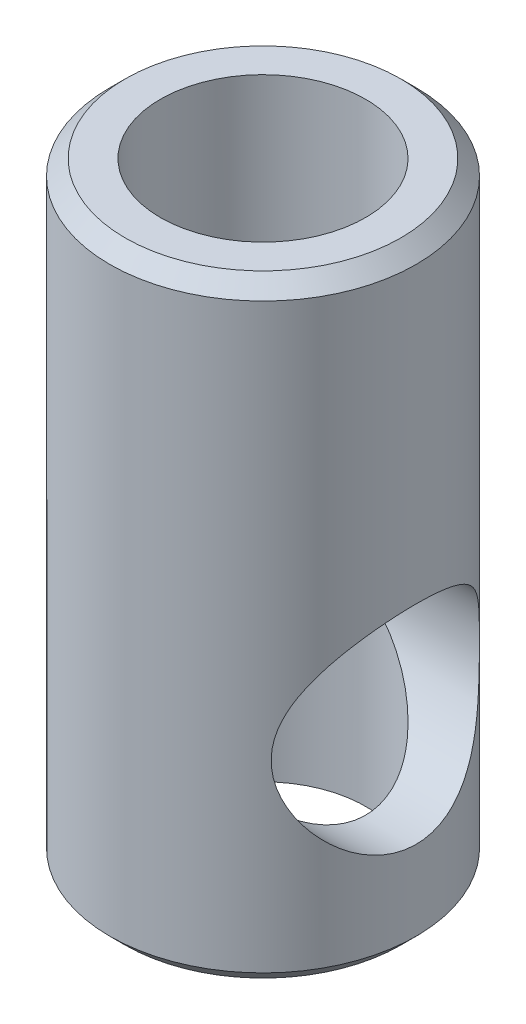
ISO-10303-21;
HEADER;
FILE_DESCRIPTION(('STEP AP214'),'2;1');
FILE_NAME('part.step','',(''),(''),'','','');
FILE_SCHEMA(('AUTOMOTIVE_DESIGN { 1 0 10303 214 1 1 1 1 }'));
ENDSEC;
DATA;
#1=APPLICATION_CONTEXT('core data for automotive mechanical design processes');
#2=APPLICATION_PROTOCOL_DEFINITION('international standard','automotive_design',2000,#1);
#3=PRODUCT_CONTEXT('',#1,'mechanical');
#4=PRODUCT('Part','Part','',(#3));
#5=PRODUCT_RELATED_PRODUCT_CATEGORY('part','',(#4));
#6=PRODUCT_DEFINITION_FORMATION('','',#4);
#7=PRODUCT_DEFINITION_CONTEXT('part definition',#1,'design');
#8=PRODUCT_DEFINITION('design','',#6,#7);
#9=PRODUCT_DEFINITION_SHAPE('','',#8);
#10=(LENGTH_UNIT() NAMED_UNIT(*) SI_UNIT(.MILLI.,.METRE.));
#11=(NAMED_UNIT(*) PLANE_ANGLE_UNIT() SI_UNIT($,.RADIAN.));
#12=(NAMED_UNIT(*) SI_UNIT($,.STERADIAN.) SOLID_ANGLE_UNIT());
#13=UNCERTAINTY_MEASURE_WITH_UNIT(LENGTH_MEASURE(1.E-05),#10,'distance_accuracy_value','');
#14=(GEOMETRIC_REPRESENTATION_CONTEXT(3) GLOBAL_UNCERTAINTY_ASSIGNED_CONTEXT((#13)) GLOBAL_UNIT_ASSIGNED_CONTEXT((#10,
#11,#12)) REPRESENTATION_CONTEXT('',''));
#15=CARTESIAN_POINT('',(0.,0.,0.));
#16=DIRECTION('',(0.,0.,1.));
#17=DIRECTION('',(1.,0.,0.));
#18=AXIS2_PLACEMENT_3D('',#15,#16,#17);
#19=CARTESIAN_POINT('',(0.,0.,0.));
#20=DIRECTION('',(0.,1.,0.));
#21=DIRECTION('',(0.,0.,1.));
#22=AXIS2_PLACEMENT_3D('',#19,#20,#21);
#23=CYLINDRICAL_SURFACE('',#22,3.35);
#24=CARTESIAN_POINT('',(0.,5.91905249806889,3.35));
#25=CARTESIAN_POINT('',(0.0439623851782986,5.91903452786912,3.34999806472464));
#26=CARTESIAN_POINT('',(0.0880173710148057,5.91388607891871,3.34911579506336));
#27=CARTESIAN_POINT('',(0.174263639585694,5.89498391835163,3.34574858884309));
#28=CARTESIAN_POINT('',(0.216439931013727,5.88117095714873,3.34325261382313));
#29=CARTESIAN_POINT('',(0.301539047282528,5.84670763373969,3.33669562524604));
#30=CARTESIAN_POINT('',(0.344261247190914,5.82560618994305,3.33252727152574));
#31=CARTESIAN_POINT('',(0.427464880746107,5.77956003534029,3.32287946100156));
#32=CARTESIAN_POINT('',(0.467941076553898,5.75460681508355,3.31739708603157));
#33=CARTESIAN_POINT('',(0.587362523159864,5.67610001288488,3.29909864505432));
#34=CARTESIAN_POINT('',(0.663771734531115,5.61916524537362,3.28447677434776));
#35=CARTESIAN_POINT('',(0.797584786647272,5.51390378647904,3.25423094354207));
#36=CARTESIAN_POINT('',(0.855687631786739,5.46618833612479,3.23941890827266));
#37=CARTESIAN_POINT('',(0.970155089900703,5.36962552345799,3.20699857506386));
#38=CARTESIAN_POINT('',(1.02651971069314,5.3207781662381,3.18939028970325));
#39=CARTESIAN_POINT('',(1.19375660397676,5.17344918925596,3.13230851027964));
#40=CARTESIAN_POINT('',(1.30262534311286,5.07430166389654,3.08861173248982));
#41=CARTESIAN_POINT('',(1.51557838042795,4.87737556282652,2.98985256026257));
#42=CARTESIAN_POINT('',(1.61967791892955,4.77959343928558,2.93482998355986));
#43=CARTESIAN_POINT('',(1.82321081960593,4.58674685339341,2.81291019347728));
#44=CARTESIAN_POINT('',(1.92264805491897,4.49168016185164,2.74602306557727));
#45=CARTESIAN_POINT('',(2.08920583636258,4.3316094688714,2.62018384640405));
#46=CARTESIAN_POINT('',(2.1576153312944,4.26560527852777,2.56420807734024));
#47=CARTESIAN_POINT('',(2.29118333387431,4.13637236791503,2.44560134420055));
#48=CARTESIAN_POINT('',(2.35634159667265,4.07314385672484,2.38296987999369));
#49=CARTESIAN_POINT('',(2.54600855833429,3.88872025811157,2.18487992757305));
#50=CARTESIAN_POINT('',(2.66499025353782,3.77251608446584,2.03901861162007));
#51=CARTESIAN_POINT('',(2.85577333712912,3.58578231631028,1.75746473292479));
#52=CARTESIAN_POINT('',(2.93205904060399,3.51096953564912,1.62764534087877));
#53=CARTESIAN_POINT('',(3.06868919516377,3.3768312380715,1.35245882556544));
#54=CARTESIAN_POINT('',(3.12905381793467,3.3174861250696,1.20711170704843));
#55=CARTESIAN_POINT('',(3.22197237757514,3.22608054381034,0.92715430934452));
#56=CARTESIAN_POINT('',(3.25740103644612,3.19120272782421,0.794426773176839));
#57=CARTESIAN_POINT('',(3.31190134865702,3.137535485255,0.522488645980093));
#58=CARTESIAN_POINT('',(3.330982633916,3.11873658493981,0.38328192355885));
#59=CARTESIAN_POINT('',(3.35142950187021,3.09859196847822,0.101865668515589));
#60=CARTESIAN_POINT('',(3.35274140949605,3.09729913202583,-0.0403516629260111));
#61=CARTESIAN_POINT('',(3.33740675407323,3.11240761583699,-0.322852896600733));
#62=CARTESIAN_POINT('',(3.32075836799423,3.12881073229942,-0.463136601100275));
#63=CARTESIAN_POINT('',(3.27188758245116,3.17693945390984,-0.731457912402938));
#64=CARTESIAN_POINT('',(3.24039661119362,3.20794539620651,-0.859762583679806));
#65=CARTESIAN_POINT('',(3.164045472807,3.28307016649274,-1.10826222069976));
#66=CARTESIAN_POINT('',(3.11917792760078,3.32719623107291,-1.22845266591645));
#67=CARTESIAN_POINT('',(2.99834260833408,3.4459230822971,-1.50437970559369));
#68=CARTESIAN_POINT('',(2.91707862256629,3.52568881490888,-1.65557351482796));
#69=CARTESIAN_POINT('',(2.73802135761134,3.70108368417063,-1.93745368028768));
#70=CARTESIAN_POINT('',(2.6402093062438,3.79673083444,-2.06811641763997));
#71=CARTESIAN_POINT('',(2.46506479170282,3.96745321073576,-2.27108696418114));
#72=CARTESIAN_POINT('',(2.39096735140461,4.03953662837233,-2.34882279483207));
#73=CARTESIAN_POINT('',(2.23794638865838,4.18795434519141,-2.49505556821144));
#74=CARTESIAN_POINT('',(2.15902007995531,4.26429109623333,-2.56354710251005));
#75=CARTESIAN_POINT('',(1.99668840550109,4.42062918446191,-2.69193455070737));
#76=CARTESIAN_POINT('',(1.91325872510115,4.50064998012911,-2.75177567241104));
#77=CARTESIAN_POINT('',(1.74299496152062,4.66292055581712,-2.86265297028896));
#78=CARTESIAN_POINT('',(1.65616408645913,4.74516821380033,-2.91369720969064));
#79=CARTESIAN_POINT('',(1.47594619195549,4.91415618281167,-3.00913148778578));
#80=CARTESIAN_POINT('',(1.38243542461165,5.00094838062657,-3.05319454977325));
#81=CARTESIAN_POINT('',(1.19155322820837,5.1749735096999,-3.13264271847222));
#82=CARTESIAN_POINT('',(1.09417014990368,5.2622069531233,-3.16799890870076));
#83=CARTESIAN_POINT('',(0.945168243703067,5.39083561194569,-3.21431332980005));
#84=CARTESIAN_POINT('',(0.895308668091493,5.4331042272381,-3.22856826639537));
#85=CARTESIAN_POINT('',(0.794101806863971,5.51650367207555,-3.2549409886966));
#86=CARTESIAN_POINT('',(0.742754943806716,5.55763481842358,-3.26705937462431));
#87=CARTESIAN_POINT('',(0.638285971655377,5.63757321977029,-3.28906189016123));
#88=CARTESIAN_POINT('',(0.585175559765211,5.67639231378974,-3.29895828134242));
#89=CARTESIAN_POINT('',(0.475965252147176,5.75007028832156,-3.31647671191804));
#90=CARTESIAN_POINT('',(0.419872617562182,5.78493819392581,-3.32410400186039));
#91=CARTESIAN_POINT('',(0.322380260255068,5.83641855179646,-3.33468299508524));
#92=CARTESIAN_POINT('',(0.282265747782886,5.85525275101071,-3.33834661398078));
#93=CARTESIAN_POINT('',(0.199734879901415,5.88684248548995,-3.34429325222318));
#94=CARTESIAN_POINT('',(0.157334283689794,5.89963487120818,-3.34658466458276));
#95=CARTESIAN_POINT('',(0.0806724054546333,5.91438565129484,-3.34919418702016));
#96=CARTESIAN_POINT('',(0.0467885275286041,5.91816194753381,-3.34984546116824));
#97=CARTESIAN_POINT('',(-0.0211353117418617,5.91965988711129,-3.35010542762384));
#98=CARTESIAN_POINT('',(-0.0551753148263753,5.91737980418965,-3.34971382267766));
#99=CARTESIAN_POINT('',(-0.130897852417956,5.90595134389963,-3.34770738678523));
#100=CARTESIAN_POINT('',(-0.172320095574676,5.89520235122925,-3.34580655250238));
#101=CARTESIAN_POINT('',(-0.253010202893116,5.86749991422461,-3.34067939152511));
#102=CARTESIAN_POINT('',(-0.292266587965697,5.85051649756308,-3.33744665228323));
#103=CARTESIAN_POINT('',(-0.388156384453282,5.8031268429009,-3.32794244971632));
#104=CARTESIAN_POINT('',(-0.443476233832153,5.77028639849789,-3.32096168267218));
#105=CARTESIAN_POINT('',(-0.551045665304778,5.70031047171435,-3.30481571862579));
#106=CARTESIAN_POINT('',(-0.603286406883393,5.66316345203653,-3.29564458063833));
#107=CARTESIAN_POINT('',(-0.705979583006067,5.58635734314274,-3.27518661697102));
#108=CARTESIAN_POINT('',(-0.756418423683168,5.54668369083001,-3.26388661928474));
#109=CARTESIAN_POINT('',(-0.855694951513702,5.46612998021729,-3.23927342020906));
#110=CARTESIAN_POINT('',(-0.904534477722233,5.42525141821029,-3.22596263757195));
#111=CARTESIAN_POINT('',(-1.06791482024008,5.28580840615279,-3.17750148114372));
#112=CARTESIAN_POINT('',(-1.17980197667018,5.18573513906741,-3.13762873503081));
#113=CARTESIAN_POINT('',(-1.39904256986185,4.98576005074626,-3.04618567858187));
#114=CARTESIAN_POINT('',(-1.50639095419764,4.88585853347008,-2.9946027193812));
#115=CARTESIAN_POINT('',(-1.71609561980965,4.68858753013784,-2.87954236688942));
#116=CARTESIAN_POINT('',(-1.8184699371737,4.59120960455918,-2.81611273823471));
#117=CARTESIAN_POINT('',(-2.01797338836229,4.40026231703398,-2.67676470918748));
#118=CARTESIAN_POINT('',(-2.11510652189323,4.30669006468679,-2.60085601623204));
#119=CARTESIAN_POINT('',(-2.33309797923104,4.09586910916841,-2.40964024468361));
#120=CARTESIAN_POINT('',(-2.45166655048015,3.98056487596905,-2.28948344571812));
#121=CARTESIAN_POINT('',(-2.67400839728279,3.76371979314201,-2.0253116272282));
#122=CARTESIAN_POINT('',(-2.77779882598259,3.66216299358656,-1.88132469454973));
#123=CARTESIAN_POINT('',(-2.94570161844085,3.49759373690723,-1.60191476841699));
#124=CARTESIAN_POINT('',(-3.01357875885858,3.43095555407178,-1.47090817040276));
#125=CARTESIAN_POINT('',(-3.13322283547264,3.31339341345042,-1.19495572039632));
#126=CARTESIAN_POINT('',(-3.18499904546874,3.26246040995218,-1.05001795568166));
#127=CARTESIAN_POINT('',(-3.24806985867941,3.2003872413246,-0.823884746039208));
#128=CARTESIAN_POINT('',(-3.26672002826642,3.18202589277153,-0.746623289426567));
#129=CARTESIAN_POINT('',(-3.29861127713061,3.15062267282826,-0.589948768036869));
#130=CARTESIAN_POINT('',(-3.31185524150884,3.13757796414064,-0.510536875064773));
#131=CARTESIAN_POINT('',(-3.33261472469935,3.11712877819129,-0.350287665123893));
#132=CARTESIAN_POINT('',(-3.34013330278818,3.10972128876512,-0.26945113305021));
#133=CARTESIAN_POINT('',(-3.34927395268731,3.10071543886095,-0.107152858797925));
#134=CARTESIAN_POINT('',(-3.35089692594995,3.0991161902888,-0.025691214109545));
#135=CARTESIAN_POINT('',(-3.34721878551388,3.10274043762259,0.194430097353977));
#136=CARTESIAN_POINT('',(-3.33623828822351,3.11356020702051,0.332980637022291));
#137=CARTESIAN_POINT('',(-3.29772995259784,3.15149104628482,0.605350535926403));
#138=CARTESIAN_POINT('',(-3.27020065333337,3.17860355447504,0.739169476351879));
#139=CARTESIAN_POINT('',(-3.20056515187801,3.24714286768619,0.998412223409368));
#140=CARTESIAN_POINT('',(-3.15851936174432,3.28851034764766,1.12386829127814));
#141=CARTESIAN_POINT('',(-3.06205922320947,3.38333052590809,1.36498728792976));
#142=CARTESIAN_POINT('',(-3.00764051293156,3.43678748612608,1.48064674328871));
#143=CARTESIAN_POINT('',(-2.85952453430319,3.58210958017662,1.75510873195268));
#144=CARTESIAN_POINT('',(-2.75962477057654,3.67998152628056,1.90739150787707));
#145=CARTESIAN_POINT('',(-2.54324155310957,3.89135462453797,2.18767985890993));
#146=CARTESIAN_POINT('',(-2.42671116416266,4.00489997963955,2.31561424820497));
#147=CARTESIAN_POINT('',(-2.2196485526643,4.20567740497623,2.51181604866486));
#148=CARTESIAN_POINT('',(-2.13222730209063,4.29018173178893,2.5862976674081));
#149=CARTESIAN_POINT('',(-1.95259939650331,4.46295952915306,2.72446412832554));
#150=CARTESIAN_POINT('',(-1.86039039402531,4.55123484481089,2.78814360759209));
#151=CARTESIAN_POINT('',(-1.67204530674769,4.73014955537972,2.90500122083339));
#152=CARTESIAN_POINT('',(-1.57591473693322,4.82078556962279,2.95819352776397));
#153=CARTESIAN_POINT('',(-1.37991116092394,5.00322532836432,3.05455070837047));
#154=CARTESIAN_POINT('',(-1.28004006073002,5.09502846281409,3.09772061039583));
#155=CARTESIAN_POINT('',(-1.10093099564092,5.25565243117005,3.16500128193762));
#156=CARTESIAN_POINT('',(-1.02259598369912,5.32462194297162,3.1911929195875));
#157=CARTESIAN_POINT('',(-0.862632042106696,5.46086127790323,3.23810839182258));
#158=CARTESIAN_POINT('',(-0.780999652731928,5.52812918867215,3.25882630183349));
#159=CARTESIAN_POINT('',(-0.633715714436901,5.6412350991913,3.29014659626955));
#160=CARTESIAN_POINT('',(-0.569196542964993,5.68821374197813,3.30198272119085));
#161=CARTESIAN_POINT('',(-0.435342431661902,5.77585038915792,3.32228337882432));
#162=CARTESIAN_POINT('',(-0.366022197247966,5.81652655780698,3.33075771496087));
#163=CARTESIAN_POINT('',(-0.256709452358659,5.86565861007018,3.34034498952072));
#164=CARTESIAN_POINT('',(-0.219605653709217,5.88000775585175,3.34301365165824));
#165=CARTESIAN_POINT('',(-0.143577657416097,5.90265828910654,3.34713567556114));
#166=CARTESIAN_POINT('',(-0.104663303318263,5.91098905456811,3.34859494603859));
#167=CARTESIAN_POINT('',(-0.0544908506470534,5.9166036977241,3.34957455617922));
#168=CARTESIAN_POINT('',(-0.0436133411334669,5.91751853102715,3.34973373226646));
#169=CARTESIAN_POINT('',(-0.0218257875344827,5.91874511962626,3.3499466870024));
#170=CARTESIAN_POINT('',(-0.0109157482577712,5.91905696002372,3.35000048052394));
#171=CARTESIAN_POINT('',(0.,5.91905249806889,3.35));
#172=B_SPLINE_CURVE_WITH_KNOTS('',3,(#24,#25,#26,#27,#28,#29,#30,#31,#32,#33,#34,#35,#36,#37,
#38,#39,#40,#41,#42,#43,#44,#45,#46,#47,#48,#49,#50,#51,#52,#53,#54,#55,#56,#57,#58,#59,#60,#61,
#62,#63,#64,#65,#66,#67,#68,#69,#70,#71,#72,#73,#74,#75,#76,#77,#78,#79,#80,#81,#82,#83,#84,#85,
#86,#87,#88,#89,#90,#91,#92,#93,#94,#95,#96,#97,#98,#99,#100,#101,#102,#103,#104,#105,#106,#107,
#108,#109,#110,#111,#112,#113,#114,#115,#116,#117,#118,#119,#120,#121,#122,#123,#124,#125,#126,
#127,#128,#129,#130,#131,#132,#133,#134,#135,#136,#137,#138,#139,#140,#141,#142,#143,#144,#145,
#146,#147,#148,#149,#150,#151,#152,#153,#154,#155,#156,#157,#158,#159,#160,#161,#162,#163,#164,
#165,#166,#167,#168,#169,#170,#171),.UNSPECIFIED.,.T.,.F.,(4,2,2,2,2,2,2,2,2,2,2,2,2,2,2,2,2,2,
2,2,2,2,2,2,2,2,2,2,2,2,2,2,2,2,2,2,2,2,2,2,2,2,2,2,2,2,2,2,2,2,2,2,2,2,2,2,2,2,2,2,2,2,2,2,2,2,
2,2,2,2,2,2,2,4),(0.,0.131826302395599,0.264564035062631,0.407706461008521,0.551169770794921,
0.839861747735211,1.06970222074298,1.29954165985558,1.75979772173289,2.21846249756536,
2.67673923699271,3.00741226297294,3.33811015441373,3.99819252847475,4.50082860728986,
5.00282476350884,5.42621260384274,5.84935081095352,6.27376688640108,6.69822604556473,
7.10366201195667,7.50932201848677,8.07405555823687,8.63943408273626,9.02698399670085,
9.41475967516357,9.80489298605488,10.1946667763143,10.5992671092988,11.0051935721647,
11.2058567527278,11.4064634707866,11.6059343816476,11.8049400745699,11.9380482968737,
12.0703338276346,12.1721187122123,12.2739326118232,12.4016637841091,12.5300172497038,
12.7236337165189,12.9177814192249,13.1131723721112,13.3083301357145,13.7736824938054,
14.239539917381,14.7035580827442,15.167216982712,15.7784639595101,16.3889955685625,
16.8729149384475,17.3565550624,17.6009568049344,17.8452279478225,18.0893684762287,
18.3334716733821,18.7494355777565,19.1654362088419,19.5797260668294,19.9941622032157,
20.6110211696081,21.2296567972541,21.6568927113913,22.0843401172652,22.5112058260014,
22.9378569065126,23.2605341175577,23.5835591656233,23.825496576807,24.0667231865704,
24.186007025711,24.3047045869672,24.3374413425923,24.3701734776862),.UNSPECIFIED.);
#173=CARTESIAN_POINT('',(0.,5.91905249806889,3.35));
#174=VERTEX_POINT('',#173);
#175=EDGE_CURVE('E54',#174,#174,#172,.T.);
#176=ORIENTED_EDGE('',*,*,#175,.T.);
#177=EDGE_LOOP('',(#176));
#178=FACE_BOUND('',#177,.T.);
#179=CARTESIAN_POINT('',(0.,0.,0.));
#180=DIRECTION('',(0.,1.,0.));
#181=DIRECTION('',(0.,0.,1.));
#182=AXIS2_PLACEMENT_3D('',#179,#180,#181);
#183=CIRCLE('',#182,3.35);
#184=CARTESIAN_POINT('',(0.,0.,3.35));
#185=VERTEX_POINT('',#184);
#186=EDGE_CURVE('E53',#185,#185,#183,.T.);
#187=ORIENTED_EDGE('',*,*,#186,.F.);
#188=EDGE_LOOP('',(#187));
#189=FACE_BOUND('',#188,.T.);
#190=ADVANCED_FACE('F33',(#178,#189),#23,.F.);
#191=CARTESIAN_POINT('',(0.,0.,0.));
#192=DIRECTION('',(0.,1.,0.));
#193=DIRECTION('',(0.,0.,1.));
#194=AXIS2_PLACEMENT_3D('',#191,#192,#193);
#195=PLANE('',#194);
#196=CARTESIAN_POINT('',(0.,0.,0.));
#197=DIRECTION('',(0.,1.,0.));
#198=DIRECTION('',(0.,0.,1.));
#199=AXIS2_PLACEMENT_3D('',#196,#197,#198);
#200=CIRCLE('',#199,4.5);
#201=CARTESIAN_POINT('',(0.,0.,4.5));
#202=VERTEX_POINT('',#201);
#203=EDGE_CURVE('E10',#202,#202,#200,.F.);
#204=ORIENTED_EDGE('',*,*,#203,.T.);
#205=EDGE_LOOP('',(#204));
#206=FACE_BOUND('',#205,.T.);
#207=ORIENTED_EDGE('',*,*,#186,.T.);
#208=EDGE_LOOP('',(#207));
#209=FACE_BOUND('',#208,.T.);
#210=ADVANCED_FACE('F92',(#206,#209),#195,.F.);
#211=CARTESIAN_POINT('',(0.,20.,0.));
#212=DIRECTION('',(0.,1.,0.));
#213=DIRECTION('',(0.,0.,1.));
#214=AXIS2_PLACEMENT_3D('',#211,#212,#213);
#215=CYLINDRICAL_SURFACE('',#214,5.);
#216=CARTESIAN_POINT('',(0.,19.5,0.));
#217=DIRECTION('',(0.,-1.,0.));
#218=DIRECTION('',(0.,0.,-1.));
#219=AXIS2_PLACEMENT_3D('',#216,#217,#218);
#220=CIRCLE('',#219,5.);
#221=CARTESIAN_POINT('',(0.,19.5,-5.));
#222=VERTEX_POINT('',#221);
#223=EDGE_CURVE('E40',#222,#222,#220,.T.);
#224=ORIENTED_EDGE('',*,*,#223,.T.);
#225=EDGE_LOOP('',(#224));
#226=FACE_BOUND('',#225,.T.);
#227=CARTESIAN_POINT('',(0.,0.5,0.));
#228=DIRECTION('',(0.,1.,0.));
#229=DIRECTION('',(0.,0.,1.));
#230=AXIS2_PLACEMENT_3D('',#227,#228,#229);
#231=CIRCLE('',#230,5.);
#232=CARTESIAN_POINT('',(0.,0.5,5.));
#233=VERTEX_POINT('',#232);
#234=EDGE_CURVE('E44',#233,#233,#231,.T.);
#235=ORIENTED_EDGE('',*,*,#234,.T.);
#236=EDGE_LOOP('',(#235));
#237=FACE_BOUND('',#236,.T.);
#238=CARTESIAN_POINT('',(-5.,9.9,0.));
#239=CARTESIAN_POINT('',(-4.99999379754221,9.89999313671967,0.170071412933929));
#240=CARTESIAN_POINT('',(-4.99124394726156,9.8871628699533,0.34018762878352));
#241=CARTESIAN_POINT('',(-4.95709368262945,9.83663230683821,0.674986491817607));
#242=CARTESIAN_POINT('',(-4.93168185778301,9.79891496714994,0.839665334131769));
#243=CARTESIAN_POINT('',(-4.86670931431736,9.7009673114579,1.15821624002657));
#244=CARTESIAN_POINT('',(-4.82721757811424,9.64084669318219,1.31213669085729));
#245=CARTESIAN_POINT('',(-4.73721970198923,9.50068898486497,1.60703091690267));
#246=CARTESIAN_POINT('',(-4.68671231865286,9.4206496463118,1.74800322801371));
#247=CARTESIAN_POINT('',(-4.57349505925956,9.23545145579277,2.02674385114573));
#248=CARTESIAN_POINT('',(-4.5101081616381,9.1287205418135,2.16318487204606));
#249=CARTESIAN_POINT('',(-4.3790539229543,8.89693390755037,2.41751348877072));
#250=CARTESIAN_POINT('',(-4.31138040705437,8.77185139438897,2.53537342566426));
#251=CARTESIAN_POINT('',(-4.20505879450574,8.56082471782457,2.70610068741068));
#252=CARTESIAN_POINT('',(-4.16607553068975,8.48031212519362,2.76557447057535));
#253=CARTESIAN_POINT('',(-4.08958263717546,8.31387972394594,2.8774839395455));
#254=CARTESIAN_POINT('',(-4.05207336288054,8.22795862408482,2.92991793521697));
#255=CARTESIAN_POINT('',(-3.94374157557023,7.96257974543242,3.07595665679275));
#256=CARTESIAN_POINT('',(-3.87688828101203,7.77508098058068,3.1586446840846));
#257=CARTESIAN_POINT('',(-3.7825677599955,7.44087646811611,3.27045609202449));
#258=CARTESIAN_POINT('',(-3.74930032111789,7.29866440705767,3.30819867148645));
#259=CARTESIAN_POINT('',(-3.69833051578608,7.00793633094295,3.3650909830708));
#260=CARTESIAN_POINT('',(-3.680600108965,6.85943218160186,3.38427421660365));
#261=CARTESIAN_POINT('',(-3.6634727474694,6.55938303708684,3.40281604059143));
#262=CARTESIAN_POINT('',(-3.6641623574749,6.40782702987935,3.40208102520501));
#263=CARTESIAN_POINT('',(-3.68397189098517,6.10732555201095,3.3806118785229));
#264=CARTESIAN_POINT('',(-3.70310516936646,5.95838205261584,3.35986325556638));
#265=CARTESIAN_POINT('',(-3.75529267520972,5.67496347099455,3.3013912241245));
#266=CARTESIAN_POINT('',(-3.78756416185567,5.54013926069762,3.26461516414671));
#267=CARTESIAN_POINT('',(-3.86216699461495,5.27848805015691,3.17600695109887));
#268=CARTESIAN_POINT('',(-3.90450613103583,5.15166733963312,3.1241631317168));
#269=CARTESIAN_POINT('',(-4.01787197396246,4.84712954385919,2.97806617290995));
#270=CARTESIAN_POINT('',(-4.09280361684193,4.67484450171609,2.87547124091789));
#271=CARTESIAN_POINT('',(-4.24675188540495,4.35172046015526,2.64284501014807));
#272=CARTESIAN_POINT('',(-4.32577589345511,4.20092219910321,2.51276272518319));
#273=CARTESIAN_POINT('',(-4.48026750776573,3.92194744002686,2.22576045104788));
#274=CARTESIAN_POINT('',(-4.55569836425437,3.79397828313889,2.06861767878051));
#275=CARTESIAN_POINT('',(-4.69451577956614,3.56629993496087,1.73053207774279));
#276=CARTESIAN_POINT('',(-4.75792711475772,3.46653239704599,1.5496395383851));
#277=CARTESIAN_POINT('',(-4.85376052313937,3.31858598447527,1.21031812251475));
#278=CARTESIAN_POINT('',(-4.88993590136625,3.26387431000232,1.0557942509248));
#279=CARTESIAN_POINT('',(-4.94787512765953,3.17696981268351,0.737937683786678));
#280=CARTESIAN_POINT('',(-4.96964868952906,3.1447618106298,0.574611006170908));
#281=CARTESIAN_POINT('',(-4.99686599120607,3.10457785864007,0.243059679549883));
#282=CARTESIAN_POINT('',(-5.00225464370477,3.09668365238314,0.0748204234146109));
#283=CARTESIAN_POINT('',(-4.99601834150487,3.10585633032721,-0.260662596303329));
#284=CARTESIAN_POINT('',(-4.98439253876036,3.12292445871765,-0.427906309848314));
#285=CARTESIAN_POINT('',(-4.9462992143931,3.17941616110803,-0.747437638567901));
#286=CARTESIAN_POINT('',(-4.92065320949067,3.21760357151959,-0.900047748369173));
#287=CARTESIAN_POINT('',(-4.85715830656358,3.31357906807078,-1.19623514421437));
#288=CARTESIAN_POINT('',(-4.81930717047773,3.37137074915677,-1.33981076782461));
#289=CARTESIAN_POINT('',(-4.73058382723068,3.50977019698339,-1.62662113661425));
#290=CARTESIAN_POINT('',(-4.67890793612585,3.59184166117864,-1.76889541573913));
#291=CARTESIAN_POINT('',(-4.56800730235859,3.77384902651318,-2.03827658329355));
#292=CARTESIAN_POINT('',(-4.50877680902653,3.8737985602605,-2.1653717729659));
#293=CARTESIAN_POINT('',(-4.37635912927187,4.10764820140525,-2.42318500327142));
#294=CARTESIAN_POINT('',(-4.30249593251157,4.24443081682193,-2.55094438647673));
#295=CARTESIAN_POINT('',(-4.15628739672658,4.53762946922112,-2.78281456782194));
#296=CARTESIAN_POINT('',(-4.08394273111718,4.69405401062656,-2.88691506711087));
#297=CARTESIAN_POINT('',(-3.958163841109,5.00201970131565,-3.05654923609815));
#298=CARTESIAN_POINT('',(-3.90349935582682,5.1512010669556,-3.12543640805701));
#299=CARTESIAN_POINT('',(-3.80743484176221,5.46164439981458,-3.24178383741316));
#300=CARTESIAN_POINT('',(-3.76600879778757,5.62288189573049,-3.28928619471078));
#301=CARTESIAN_POINT('',(-3.708063965905,5.92712079879966,-3.35437905995446));
#302=CARTESIAN_POINT('',(-3.68857015551482,6.06876268415598,-3.37560309382006));
#303=CARTESIAN_POINT('',(-3.66617104186076,6.35485358515967,-3.39992506795482));
#304=CARTESIAN_POINT('',(-3.66325103659319,6.49929999882686,-3.40303907301474));
#305=CARTESIAN_POINT('',(-3.67444337801691,6.78663582679467,-3.3909465536332));
#306=CARTESIAN_POINT('',(-3.68854603086687,6.9295260805381,-3.37575045619881));
#307=CARTESIAN_POINT('',(-3.73161842547704,7.21014089122974,-3.32806631877975));
#308=CARTESIAN_POINT('',(-3.76060902503849,7.34785790928861,-3.29555401666084));
#309=CARTESIAN_POINT('',(-3.84093673857146,7.65844119838114,-3.20188962723743));
#310=CARTESIAN_POINT('',(-3.89645644489005,7.82844818101033,-3.13490135545771));
#311=CARTESIAN_POINT('',(-4.01849162330636,8.15255891149135,-2.97685755826161));
#312=CARTESIAN_POINT('',(-4.08502361197318,8.30663819785503,-2.88576575685677));
#313=CARTESIAN_POINT('',(-4.22317893126136,8.60056475788136,-2.67964327311611));
#314=CARTESIAN_POINT('',(-4.29487790619102,8.74006212586728,-2.56416664172378));
#315=CARTESIAN_POINT('',(-4.435859272984,8.99974500985711,-2.31171566737488));
#316=CARTESIAN_POINT('',(-4.50514096829084,9.11992499481933,-2.17473518945098));
#317=CARTESIAN_POINT('',(-4.60705079049048,9.2905777646502,-1.9450745729422));
#318=CARTESIAN_POINT('',(-4.64248216683703,9.34858602720363,-1.85914274463261));
#319=CARTESIAN_POINT('',(-4.70979259877776,9.45701844485621,-1.6813313368936));
#320=CARTESIAN_POINT('',(-4.74167342912665,9.50744639345469,-1.58945476560855));
#321=CARTESIAN_POINT('',(-4.80091081831998,9.60000103770361,-1.40037564974994));
#322=CARTESIAN_POINT('',(-4.82827367150954,9.64213929831448,-1.30318077038827));
#323=CARTESIAN_POINT('',(-4.87764292518459,9.71748466731234,-1.10413786445615));
#324=CARTESIAN_POINT('',(-4.89965179949851,9.75069590121686,-1.00229201282288));
#325=CARTESIAN_POINT('',(-4.94502974124755,9.81876638344047,-0.75382225010434));
#326=CARTESIAN_POINT('',(-4.96551129815005,9.84910884971332,-0.605381156229831));
#327=CARTESIAN_POINT('',(-4.9929959285727,9.88972385251264,-0.304637414212092));
#328=CARTESIAN_POINT('',(-5.00000555567695,9.90000614759014,-0.152336680190557));
#329=CARTESIAN_POINT('',(-5.,9.9,0.));
#330=B_SPLINE_CURVE_WITH_KNOTS('',3,(#238,#239,#240,#241,#242,#243,#244,#245,#246,#247,#248,
#249,#250,#251,#252,#253,#254,#255,#256,#257,#258,#259,#260,#261,#262,#263,#264,#265,#266,#267,
#268,#269,#270,#271,#272,#273,#274,#275,#276,#277,#278,#279,#280,#281,#282,#283,#284,#285,#286,
#287,#288,#289,#290,#291,#292,#293,#294,#295,#296,#297,#298,#299,#300,#301,#302,#303,#304,#305,
#306,#307,#308,#309,#310,#311,#312,#313,#314,#315,#316,#317,#318,#319,#320,#321,#322,#323,#324,
#325,#326,#327,#328,#329),.UNSPECIFIED.,.T.,.F.,(4,2,2,2,2,2,2,2,2,2,2,2,2,2,2,2,2,2,2,2,2,2,2,
2,2,2,2,2,2,2,2,2,2,2,2,2,2,2,2,2,2,2,2,2,2,4),(0.,0.509612086753705,1.01957353234679,
1.52707007756964,2.03462393721375,2.58599569043238,3.13818059436469,3.46008923425403,
3.78207502129199,4.42428680379039,4.87512521908833,5.32514830069297,5.77728663163133,
6.22975259754471,6.65848810582837,7.08755645377093,7.72640915389398,8.36645742827396,
9.0120517536887,9.65630045949822,10.1577842965794,10.6589295446876,11.1617578284616,
11.6646111753945,12.140742953508,12.6169620898477,13.1315700100089,13.6465720213541,
14.2478325138809,14.8493542394407,15.3670109381426,15.8836440304181,16.3153469363973,
16.746666834927,17.1777412268631,17.6094212021585,18.1792780810038,18.7499975253678,
19.3322329043585,19.9146346958288,20.2429248238322,20.5710501111201,20.8987143322708,
21.2262268659946,21.6829197659253,22.139390445752),.UNSPECIFIED.);
#331=CARTESIAN_POINT('',(-5.,9.9,0.));
#332=VERTEX_POINT('',#331);
#333=EDGE_CURVE('E83',#332,#332,#330,.T.);
#334=ORIENTED_EDGE('',*,*,#333,.T.);
#335=EDGE_LOOP('',(#334));
#336=FACE_BOUND('',#335,.T.);
#337=CARTESIAN_POINT('',(3.66606055596467,6.5,-3.4));
#338=CARTESIAN_POINT('',(3.66605513004881,6.41754237350806,-3.40000307203115));
#339=CARTESIAN_POINT('',(3.66885265267402,6.33510901160302,-3.39699608529816));
#340=CARTESIAN_POINT('',(3.67988298003789,6.17101308749241,-3.3850452457807));
#341=CARTESIAN_POINT('',(3.68811725619618,6.089350740027,-3.37609978578609));
#342=CARTESIAN_POINT('',(3.70963480428641,5.92742213413877,-3.35244124789039));
#343=CARTESIAN_POINT('',(3.72292582084349,5.84715821565788,-3.33771932198423));
#344=CARTESIAN_POINT('',(3.75395348004184,5.68869558773078,-3.30278336410215));
#345=CARTESIAN_POINT('',(3.77169247370172,5.61049799469776,-3.28256642721231));
#346=CARTESIAN_POINT('',(3.83010903948732,5.38135511882258,-3.21462353553021));
#347=CARTESIAN_POINT('',(3.87626364652114,5.23398794910649,-3.15932053161995));
#348=CARTESIAN_POINT('',(3.97767328024433,4.9509942403575,-3.03064511817614));
#349=CARTESIAN_POINT('',(4.03292963174995,4.81536941488767,-2.95727007737263));
#350=CARTESIAN_POINT('',(4.15711422031109,4.53535982694508,-2.78062551346201));
#351=CARTESIAN_POINT('',(4.22680219335304,4.39315611800297,-2.67443176550145));
#352=CARTESIAN_POINT('',(4.3657832728554,4.12660672588774,-2.44098366318953));
#353=CARTESIAN_POINT('',(4.43507584402914,4.00228140724902,-2.31370564207452));
#354=CARTESIAN_POINT('',(4.53960943252356,3.82214485602595,-2.09754466039498));
#355=CARTESIAN_POINT('',(4.57686372508493,3.75958575568536,-2.01517198286057));
#356=CARTESIAN_POINT('',(4.64838906786289,3.64172787258745,-1.84419466409957));
#357=CARTESIAN_POINT('',(4.68266144579532,3.58642585293775,-1.75559282854709));
#358=CARTESIAN_POINT('',(4.74722234648027,3.48375894414529,-1.57266372565406));
#359=CARTESIAN_POINT('',(4.77751564154631,3.43638452798765,-1.47834351889436));
#360=CARTESIAN_POINT('',(4.83323038268321,3.35020745831159,-1.28454642612132));
#361=CARTESIAN_POINT('',(4.85865378875018,3.31140135531905,-1.18507163525312));
#362=CARTESIAN_POINT('',(4.91475002558846,3.22643246723435,-0.932257413732929));
#363=CARTESIAN_POINT('',(4.94198362128448,3.1858376349482,-0.776203540881886));
#364=CARTESIAN_POINT('',(4.98153785775134,3.12713921997712,-0.458187593325381));
#365=CARTESIAN_POINT('',(4.99386998652732,3.10901831115968,-0.296230169215659));
#366=CARTESIAN_POINT('',(5.00256787490633,3.09622121282021,0.0293404882725851));
#367=CARTESIAN_POINT('',(4.99890641714151,3.10158498881115,0.192956071154487));
#368=CARTESIAN_POINT('',(4.97588591834255,3.13553972531433,0.516633867143182));
#369=CARTESIAN_POINT('',(4.95652228151618,3.16413748606994,0.676695025830246));
#370=CARTESIAN_POINT('',(4.90428497086455,3.24226560607359,0.985979880823404));
#371=CARTESIAN_POINT('',(4.87166878052432,3.29139750165294,1.13534960661627));
#372=CARTESIAN_POINT('',(4.7954104624915,3.40841035133082,1.42347413117832));
#373=CARTESIAN_POINT('',(4.75176623867021,3.47629487002108,1.56222690541489));
#374=CARTESIAN_POINT('',(4.6509219193234,3.63722974179678,1.84213890357839));
#375=CARTESIAN_POINT('',(4.59274837893339,3.73225415914635,1.98180671510916));
#376=CARTESIAN_POINT('',(4.47042878083369,3.94034682907863,2.24416298037636));
#377=CARTESIAN_POINT('',(4.40627588244023,4.05343585668411,2.36683157726567));
#378=CARTESIAN_POINT('',(4.26542212176033,4.31637310014332,2.61334257725603));
#379=CARTESIAN_POINT('',(4.18843836494775,4.46920277456861,2.73385588001991));
#380=CARTESIAN_POINT('',(4.04044084751781,4.79523125592687,2.94818133630301));
#381=CARTESIAN_POINT('',(3.96942392625335,4.96841916091876,3.04200768959708));
#382=CARTESIAN_POINT('',(3.85833478527651,5.29014084162937,3.18107352493592));
#383=CARTESIAN_POINT('',(3.81491705415367,5.43480188920218,3.23255709653234));
#384=CARTESIAN_POINT('',(3.74264652747532,5.73304973735152,3.31597194489765));
#385=CARTESIAN_POINT('',(3.71376703455781,5.88661959531206,3.34793908390634));
#386=CARTESIAN_POINT('',(3.67496293465713,6.20051112878107,3.39050810444132));
#387=CARTESIAN_POINT('',(3.66519764161701,6.3608782647058,3.40093045337444));
#388=CARTESIAN_POINT('',(3.66704508137185,6.68135145090114,3.3989384167712));
#389=CARTESIAN_POINT('',(3.67865771425632,6.84145750238844,3.38652413796262));
#390=CARTESIAN_POINT('',(3.71853689211327,7.13770910666454,3.3426320479813));
#391=CARTESIAN_POINT('',(3.74475135335023,7.27450371258157,3.31349178732144));
#392=CARTESIAN_POINT('',(3.80879332196524,7.5409954513235,3.23967254989999));
#393=CARTESIAN_POINT('',(3.84663160625801,7.67068586553144,3.194979148066));
#394=CARTESIAN_POINT('',(3.9492276916616,7.97853260599019,3.06804332859348));
#395=CARTESIAN_POINT('',(4.01841060924106,8.15198666643347,2.9779645731681));
#396=CARTESIAN_POINT('',(4.16363959531992,8.47925908793429,2.771300996843));
#397=CARTESIAN_POINT('',(4.23969827098388,8.63304007761618,2.65466686516819));
#398=CARTESIAN_POINT('',(4.39169871548544,8.92119043566737,2.39498570724208));
#399=CARTESIAN_POINT('',(4.46762344525952,9.05525270684126,2.25158670497547));
#400=CARTESIAN_POINT('',(4.61090712556316,9.29822442298195,1.94129809436407));
#401=CARTESIAN_POINT('',(4.67827946830323,9.40717341677098,1.77444609668592));
#402=CARTESIAN_POINT('',(4.78728970775895,9.57924251619455,1.45108789403179));
#403=CARTESIAN_POINT('',(4.83136897359054,9.64705014950804,1.29790644664172));
#404=CARTESIAN_POINT('',(4.90568560705129,9.75999533895318,0.980199823463243));
#405=CARTESIAN_POINT('',(4.93593183409975,9.80514740672782,0.815681986024171));
#406=CARTESIAN_POINT('',(4.9799426036104,9.87052229207212,0.478703795403035));
#407=CARTESIAN_POINT('',(4.9936266596164,9.89062338442626,0.306208851888005));
#408=CARTESIAN_POINT('',(5.0028375078167,9.9041757920018,-0.0403063081023459));
#409=CARTESIAN_POINT('',(4.99836832506262,9.89763301487066,-0.214326177923532));
#410=CARTESIAN_POINT('',(4.97285643114964,9.8599795150161,-0.543871730849378));
#411=CARTESIAN_POINT('',(4.95319529401442,9.83091623656145,-0.699748152111907));
#412=CARTESIAN_POINT('',(4.90062468157117,9.75222648637836,-1.00384566564613));
#413=CARTESIAN_POINT('',(4.86771245625017,9.70259574619921,-1.15206516165896));
#414=CARTESIAN_POINT('',(4.78914910016548,9.58190744363719,-1.44506429609915));
#415=CARTESIAN_POINT('',(4.74294267094436,9.50990151257499,-1.58930016695532));
#416=CARTESIAN_POINT('',(4.64188665678079,9.34800097037134,-1.86395605199957));
#417=CARTESIAN_POINT('',(4.58703491382356,9.25810189132461,-1.99437260302546));
#418=CARTESIAN_POINT('',(4.46308907440461,9.04707567788602,-2.25953270855035));
#419=CARTESIAN_POINT('',(4.39311276621821,8.92325990439086,-2.39171907948566));
#420=CARTESIAN_POINT('',(4.2517231020534,8.65638936028221,-2.63489138933666));
#421=CARTESIAN_POINT('',(4.18030686855796,8.51329195513518,-2.74582898887739));
#422=CARTESIAN_POINT('',(4.07265768648962,8.27549638810997,-2.90140743488579));
#423=CARTESIAN_POINT('',(4.03459136618568,8.18670234855331,-2.95394264686112));
#424=CARTESIAN_POINT('',(3.96155042795542,8.00363988849391,-3.05119818501606));
#425=CARTESIAN_POINT('',(3.92657671291641,7.90936988250308,-3.09591623266958));
#426=CARTESIAN_POINT('',(3.8614213026379,7.71606594055496,-3.17680940363541));
#427=CARTESIAN_POINT('',(3.83122250364557,7.61705074361659,-3.21301525561881));
#428=CARTESIAN_POINT('',(3.77715952746551,7.41456859685897,-3.27640096421229));
#429=CARTESIAN_POINT('',(3.75328965013071,7.31110575110816,-3.30358894834838));
#430=CARTESIAN_POINT('',(3.71171372495508,7.09116257128643,-3.35026210715336));
#431=CARTESIAN_POINT('',(3.69474771906087,6.97434445281149,-3.36884349965761));
#432=CARTESIAN_POINT('',(3.67192787890562,6.73833317835508,-3.39370710054448));
#433=CARTESIAN_POINT('',(3.66606839575445,6.61914126090149,-3.39999556128789));
#434=CARTESIAN_POINT('',(3.66606055596467,6.5,-3.4));
#435=B_SPLINE_CURVE_WITH_KNOTS('',3,(#337,#338,#339,#340,#341,#342,#343,#344,#345,#346,#347,
#348,#349,#350,#351,#352,#353,#354,#355,#356,#357,#358,#359,#360,#361,#362,#363,#364,#365,#366,
#367,#368,#369,#370,#371,#372,#373,#374,#375,#376,#377,#378,#379,#380,#381,#382,#383,#384,#385,
#386,#387,#388,#389,#390,#391,#392,#393,#394,#395,#396,#397,#398,#399,#400,#401,#402,#403,#404,
#405,#406,#407,#408,#409,#410,#411,#412,#413,#414,#415,#416,#417,#418,#419,#420,#421,#422,#423,
#424,#425,#426,#427,#428,#429,#430,#431,#432,#433,#434),.UNSPECIFIED.,.T.,.F.,(4,2,2,2,2,2,2,2,
2,2,2,2,2,2,2,2,2,2,2,2,2,2,2,2,2,2,2,2,2,2,2,2,2,2,2,2,2,2,2,2,2,2,2,2,2,2,2,2,4),(0.,
0.247230605927984,0.494528150546028,0.742205977124565,0.990014993042408,1.47996664753607,
1.96998968070104,2.53996254172067,3.11057957821377,3.4400096746729,3.76929233158751,
4.09817638538853,4.42692779301516,4.91520803760653,5.40311161108625,5.89184580625154,
6.3807230982348,6.86052452786733,7.3404172233704,7.8743984808752,8.40899831893801,
9.03426257066663,9.65919350245749,10.1361468268292,10.6122210712425,11.0922467044859,
11.5722700943183,11.9975056650935,12.4231366848979,13.0418475721785,13.6617168538947,
14.2903998462843,14.9180859086489,15.4355953526837,15.9527728901963,16.4724537694517,
16.9920194280461,17.4692060716851,17.9464917974834,18.4476738332844,18.9489811712089,
19.529292696232,20.1109091023629,20.4404408619918,20.7700685130777,21.0984872957336,
21.4266092752537,21.7840093160652,22.1412275307634),.UNSPECIFIED.);
#436=CARTESIAN_POINT('',(3.66606055596467,6.5,-3.4));
#437=VERTEX_POINT('',#436);
#438=EDGE_CURVE('E61',#437,#437,#435,.T.);
#439=ORIENTED_EDGE('',*,*,#438,.T.);
#440=EDGE_LOOP('',(#439));
#441=FACE_BOUND('',#440,.T.);
#442=ADVANCED_FACE('F87',(#226,#237,#336,#441),#215,.T.);
#443=CARTESIAN_POINT('',(5.,20.,0.));
#444=DIRECTION('',(0.,-1.,0.));
#445=DIRECTION('',(0.,0.,-1.));
#446=AXIS2_PLACEMENT_3D('',#443,#444,#445);
#447=PLANE('',#446);
#448=CARTESIAN_POINT('',(0.,20.,0.));
#449=DIRECTION('',(0.,-1.,0.));
#450=DIRECTION('',(0.,0.,-1.));
#451=AXIS2_PLACEMENT_3D('',#448,#449,#450);
#452=CIRCLE('',#451,4.5);
#453=CARTESIAN_POINT('',(0.,20.,-4.5));
#454=VERTEX_POINT('',#453);
#455=EDGE_CURVE('E48',#454,#454,#452,.F.);
#456=ORIENTED_EDGE('',*,*,#455,.T.);
#457=EDGE_LOOP('',(#456));
#458=FACE_BOUND('',#457,.T.);
#459=CARTESIAN_POINT('',(0.,20.,0.));
#460=DIRECTION('',(0.,1.,0.));
#461=DIRECTION('',(0.,0.,1.));
#462=AXIS2_PLACEMENT_3D('',#459,#460,#461);
#463=CIRCLE('',#462,3.35);
#464=CARTESIAN_POINT('',(0.,20.,3.35));
#465=VERTEX_POINT('',#464);
#466=EDGE_CURVE('E118',#465,#465,#463,.T.);
#467=ORIENTED_EDGE('',*,*,#466,.F.);
#468=EDGE_LOOP('',(#467));
#469=FACE_BOUND('',#468,.T.);
#470=ADVANCED_FACE('F91',(#458,#469),#447,.F.);
#471=CARTESIAN_POINT('',(0.,7.08094750193111,3.35));
#472=CARTESIAN_POINT('',(-0.0439623851782986,7.08096547213088,3.34999806472464));
#473=CARTESIAN_POINT('',(-0.0880173710148056,7.08611392108129,3.34911579506336));
#474=CARTESIAN_POINT('',(-0.174263639585694,7.10501608164837,3.34574858884309));
#475=CARTESIAN_POINT('',(-0.216439931013727,7.11882904285127,3.34325261382313));
#476=CARTESIAN_POINT('',(-0.301539047282528,7.1532923662603,3.33669562524604));
#477=CARTESIAN_POINT('',(-0.344261247190915,7.17439381005695,3.33252727152574));
#478=CARTESIAN_POINT('',(-0.427464880746107,7.22043996465971,3.32287946100156));
#479=CARTESIAN_POINT('',(-0.467941076553897,7.24539318491645,3.31739708603157));
#480=CARTESIAN_POINT('',(-0.587362523159864,7.32389998711512,3.29909864505432));
#481=CARTESIAN_POINT('',(-0.663771734531115,7.38083475462638,3.28447677434776));
#482=CARTESIAN_POINT('',(-0.797584786647272,7.48609621352096,3.25423094354207));
#483=CARTESIAN_POINT('',(-0.855687631786738,7.53381166387521,3.23941890827266));
#484=CARTESIAN_POINT('',(-0.970155089900702,7.63037447654201,3.20699857506386));
#485=CARTESIAN_POINT('',(-1.02651971069314,7.6792218337619,3.18939028970325));
#486=CARTESIAN_POINT('',(-1.19375660397676,7.82655081074404,3.13230851027964));
#487=CARTESIAN_POINT('',(-1.30262534311286,7.92569833610346,3.08861173248982));
#488=CARTESIAN_POINT('',(-1.51557838042795,8.12262443717348,2.98985256026257));
#489=CARTESIAN_POINT('',(-1.61967791892955,8.22040656071442,2.93482998355986));
#490=CARTESIAN_POINT('',(-1.82321081960593,8.41325314660659,2.81291019347728));
#491=CARTESIAN_POINT('',(-1.92264805491897,8.50831983814836,2.74602306557727));
#492=CARTESIAN_POINT('',(-2.08920583636258,8.6683905311286,2.62018384640405));
#493=CARTESIAN_POINT('',(-2.1576153312944,8.73439472147223,2.56420807734024));
#494=CARTESIAN_POINT('',(-2.29118333387432,8.86362763208497,2.44560134420055));
#495=CARTESIAN_POINT('',(-2.35634159667265,8.92685614327516,2.38296987999369));
#496=CARTESIAN_POINT('',(-2.54600855833429,9.11127974188843,2.18487992757305));
#497=CARTESIAN_POINT('',(-2.66499025353782,9.22748391553416,2.03901861162007));
#498=CARTESIAN_POINT('',(-2.85577333712912,9.41421768368972,1.75746473292479));
#499=CARTESIAN_POINT('',(-2.93205904060399,9.48903046435088,1.62764534087877));
#500=CARTESIAN_POINT('',(-3.06868919516377,9.6231687619285,1.35245882556545));
#501=CARTESIAN_POINT('',(-3.12905381793467,9.6825138749304,1.20711170704843));
#502=CARTESIAN_POINT('',(-3.22197237757514,9.77391945618965,0.92715430934452));
#503=CARTESIAN_POINT('',(-3.25740103644612,9.80879727217579,0.794426773176839));
#504=CARTESIAN_POINT('',(-3.31190134865702,9.862464514745,0.522488645980094));
#505=CARTESIAN_POINT('',(-3.330982633916,9.88126341506019,0.383281923558851));
#506=CARTESIAN_POINT('',(-3.35142950187021,9.90140803152178,0.101865668515589));
#507=CARTESIAN_POINT('',(-3.35274140949605,9.90270086797416,-0.040351662926011));
#508=CARTESIAN_POINT('',(-3.33740675407323,9.887592384163,-0.322852896600734));
#509=CARTESIAN_POINT('',(-3.32075836799423,9.87118926770058,-0.463136601100275));
#510=CARTESIAN_POINT('',(-3.27188758245116,9.82306054609016,-0.731457912402938));
#511=CARTESIAN_POINT('',(-3.24039661119362,9.79205460379348,-0.859762583679805));
#512=CARTESIAN_POINT('',(-3.164045472807,9.71692983350726,-1.10826222069976));
#513=CARTESIAN_POINT('',(-3.11917792760078,9.67280376892709,-1.22845266591645));
#514=CARTESIAN_POINT('',(-2.99834260833408,9.5540769177029,-1.50437970559369));
#515=CARTESIAN_POINT('',(-2.91707862256629,9.47431118509112,-1.65557351482796));
#516=CARTESIAN_POINT('',(-2.73802135761134,9.29891631582937,-1.93745368028768));
#517=CARTESIAN_POINT('',(-2.64020930624381,9.20326916556001,-2.06811641763996));
#518=CARTESIAN_POINT('',(-2.46506479170282,9.03254678926424,-2.27108696418114));
#519=CARTESIAN_POINT('',(-2.39096735140461,8.96046337162767,-2.34882279483207));
#520=CARTESIAN_POINT('',(-2.23794638865838,8.81204565480859,-2.49505556821144));
#521=CARTESIAN_POINT('',(-2.15902007995531,8.73570890376667,-2.56354710251005));
#522=CARTESIAN_POINT('',(-1.99668840550109,8.57937081553809,-2.69193455070737));
#523=CARTESIAN_POINT('',(-1.91325872510116,8.49935001987089,-2.75177567241104));
#524=CARTESIAN_POINT('',(-1.74299496152062,8.33707944418288,-2.86265297028896));
#525=CARTESIAN_POINT('',(-1.65616408645913,8.25483178619967,-2.91369720969064));
#526=CARTESIAN_POINT('',(-1.47594619195549,8.08584381718833,-3.00913148778578));
#527=CARTESIAN_POINT('',(-1.38243542461165,7.99905161937343,-3.05319454977324));
#528=CARTESIAN_POINT('',(-1.19155322820837,7.8250264903001,-3.13264271847222));
#529=CARTESIAN_POINT('',(-1.09417014990368,7.7377930468767,-3.16799890870076));
#530=CARTESIAN_POINT('',(-0.945168243703068,7.60916438805431,-3.21431332980005));
#531=CARTESIAN_POINT('',(-0.895308668091494,7.5668957727619,-3.22856826639537));
#532=CARTESIAN_POINT('',(-0.794101806863971,7.48349632792445,-3.2549409886966));
#533=CARTESIAN_POINT('',(-0.742754943806715,7.44236518157642,-3.26705937462431));
#534=CARTESIAN_POINT('',(-0.638285971655375,7.36242678022971,-3.28906189016123));
#535=CARTESIAN_POINT('',(-0.585175559765209,7.32360768621026,-3.29895828134242));
#536=CARTESIAN_POINT('',(-0.475965252147176,7.24992971167844,-3.31647671191804));
#537=CARTESIAN_POINT('',(-0.419872617562183,7.21506180607419,-3.32410400186039));
#538=CARTESIAN_POINT('',(-0.322380260255068,7.16358144820353,-3.33468299508524));
#539=CARTESIAN_POINT('',(-0.282265747782885,7.14474724898929,-3.33834661398078));
#540=CARTESIAN_POINT('',(-0.199734879901414,7.11315751451005,-3.34429325222318));
#541=CARTESIAN_POINT('',(-0.157334283689794,7.10036512879182,-3.34658466458276));
#542=CARTESIAN_POINT('',(-0.0806724054546346,7.08561434870515,-3.34919418702016));
#543=CARTESIAN_POINT('',(-0.0467885275286059,7.08183805246618,-3.34984546116824));
#544=CARTESIAN_POINT('',(0.02113531174186,7.08034011288871,-3.35010542762384));
#545=CARTESIAN_POINT('',(0.0551753148263741,7.08262019581035,-3.34971382267766));
#546=CARTESIAN_POINT('',(0.130897852417955,7.09404865610037,-3.34770738678523));
#547=CARTESIAN_POINT('',(0.172320095574675,7.10479764877075,-3.34580655250238));
#548=CARTESIAN_POINT('',(0.253010202893116,7.13250008577539,-3.34067939152511));
#549=CARTESIAN_POINT('',(0.292266587965697,7.14948350243692,-3.33744665228323));
#550=CARTESIAN_POINT('',(0.388156384453281,7.1968731570991,-3.32794244971632));
#551=CARTESIAN_POINT('',(0.443476233832152,7.22971360150211,-3.32096168267218));
#552=CARTESIAN_POINT('',(0.551045665304777,7.29968952828565,-3.30481571862579));
#553=CARTESIAN_POINT('',(0.603286406883392,7.33683654796347,-3.29564458063833));
#554=CARTESIAN_POINT('',(0.705979583006066,7.41364265685726,-3.27518661697102));
#555=CARTESIAN_POINT('',(0.756418423683167,7.45331630916999,-3.26388661928474));
#556=CARTESIAN_POINT('',(0.8556949515137,7.5338700197827,-3.23927342020906));
#557=CARTESIAN_POINT('',(0.904534477722231,7.5747485817897,-3.22596263757195));
#558=CARTESIAN_POINT('',(1.06791482024008,7.71419159384721,-3.17750148114372));
#559=CARTESIAN_POINT('',(1.17980197667018,7.81426486093259,-3.13762873503081));
#560=CARTESIAN_POINT('',(1.39904256986185,8.01423994925374,-3.04618567858187));
#561=CARTESIAN_POINT('',(1.50639095419764,8.11414146652991,-2.9946027193812));
#562=CARTESIAN_POINT('',(1.71609561980965,8.31141246986216,-2.87954236688942));
#563=CARTESIAN_POINT('',(1.8184699371737,8.40879039544081,-2.81611273823472));
#564=CARTESIAN_POINT('',(2.01797338836228,8.59973768296601,-2.67676470918749));
#565=CARTESIAN_POINT('',(2.11510652189322,8.6933099353132,-2.60085601623204));
#566=CARTESIAN_POINT('',(2.33309797923103,8.90413089083158,-2.40964024468361));
#567=CARTESIAN_POINT('',(2.45166655048014,9.01943512403095,-2.28948344571813));
#568=CARTESIAN_POINT('',(2.67400839728278,9.23628020685798,-2.0253116272282));
#569=CARTESIAN_POINT('',(2.77779882598259,9.33783700641343,-1.88132469454973));
#570=CARTESIAN_POINT('',(2.94570161844085,9.50240626309276,-1.601914768417));
#571=CARTESIAN_POINT('',(3.01357875885858,9.56904444592822,-1.47090817040276));
#572=CARTESIAN_POINT('',(3.13322283547264,9.68660658654958,-1.19495572039633));
#573=CARTESIAN_POINT('',(3.18499904546873,9.73753959004782,-1.05001795568167));
#574=CARTESIAN_POINT('',(3.24806985867941,9.7996127586754,-0.823884746039214));
#575=CARTESIAN_POINT('',(3.26672002826642,9.81797410722847,-0.746623289426572));
#576=CARTESIAN_POINT('',(3.2986112771306,9.84937732717174,-0.589948768036874));
#577=CARTESIAN_POINT('',(3.31185524150883,9.86242203585936,-0.510536875064779));
#578=CARTESIAN_POINT('',(3.33261472469935,9.88287122180871,-0.350287665123898));
#579=CARTESIAN_POINT('',(3.34013330278818,9.89027871123488,-0.269451133050214));
#580=CARTESIAN_POINT('',(3.34927395268731,9.89928456113905,-0.10715285879793));
#581=CARTESIAN_POINT('',(3.35089692594995,9.9008838097112,-0.0256912141095497));
#582=CARTESIAN_POINT('',(3.34721878551388,9.89725956237741,0.194430097353971));
#583=CARTESIAN_POINT('',(3.33623828822351,9.88643979297949,0.332980637022286));
#584=CARTESIAN_POINT('',(3.29772995259784,9.84850895371518,0.605350535926398));
#585=CARTESIAN_POINT('',(3.27020065333337,9.82139644552496,0.739169476351874));
#586=CARTESIAN_POINT('',(3.20056515187801,9.75285713231382,0.998412223409365));
#587=CARTESIAN_POINT('',(3.15851936174432,9.71148965235234,1.12386829127814));
#588=CARTESIAN_POINT('',(3.06205922320947,9.61666947409191,1.36498728792976));
#589=CARTESIAN_POINT('',(3.00764051293156,9.56321251387392,1.48064674328871));
#590=CARTESIAN_POINT('',(2.85952453430319,9.41789041982338,1.75510873195268));
#591=CARTESIAN_POINT('',(2.75962477057654,9.32001847371944,1.90739150787707));
#592=CARTESIAN_POINT('',(2.54324155310958,9.10864537546203,2.18767985890993));
#593=CARTESIAN_POINT('',(2.42671116416267,8.99510002036045,2.31561424820496));
#594=CARTESIAN_POINT('',(2.2196485526643,8.79432259502378,2.51181604866485));
#595=CARTESIAN_POINT('',(2.13222730209064,8.70981826821108,2.5862976674081));
#596=CARTESIAN_POINT('',(1.95259939650331,8.53704047084694,2.72446412832554));
#597=CARTESIAN_POINT('',(1.86039039402531,8.44876515518911,2.78814360759208));
#598=CARTESIAN_POINT('',(1.67204530674769,8.26985044462028,2.90500122083338));
#599=CARTESIAN_POINT('',(1.57591473693322,8.17921443037722,2.95819352776396));
#600=CARTESIAN_POINT('',(1.37991116092395,7.99677467163569,3.05455070837047));
#601=CARTESIAN_POINT('',(1.28004006073003,7.90497153718592,3.09772061039582));
#602=CARTESIAN_POINT('',(1.10093099564092,7.74434756882995,3.16500128193762));
#603=CARTESIAN_POINT('',(1.02259598369913,7.67537805702839,3.1911929195875));
#604=CARTESIAN_POINT('',(0.862632042106703,7.53913872209677,3.23810839182258));
#605=CARTESIAN_POINT('',(0.780999652731935,7.47187081132785,3.25882630183349));
#606=CARTESIAN_POINT('',(0.633715714436906,7.35876490080871,3.29014659626955));
#607=CARTESIAN_POINT('',(0.569196542964997,7.31178625802187,3.30198272119085));
#608=CARTESIAN_POINT('',(0.435342431661903,7.22414961084208,3.32228337882432));
#609=CARTESIAN_POINT('',(0.366022197247965,7.18347344219302,3.33075771496087));
#610=CARTESIAN_POINT('',(0.256709452358656,7.13434138992982,3.34034498952072));
#611=CARTESIAN_POINT('',(0.219605653709214,7.11999224414825,3.34301365165824));
#612=CARTESIAN_POINT('',(0.143577657416094,7.09734171089346,3.34713567556114));
#613=CARTESIAN_POINT('',(0.104663303318259,7.08901094543189,3.34859494603859));
#614=CARTESIAN_POINT('',(0.0544908506470497,7.0833963022759,3.34957455617922));
#615=CARTESIAN_POINT('',(0.0436133411334633,7.08248146897285,3.34973373226646));
#616=CARTESIAN_POINT('',(0.0218257875344803,7.08125488037374,3.3499466870024));
#617=CARTESIAN_POINT('',(0.01091574825777,7.08094303997628,3.35000048052394));
#618=CARTESIAN_POINT('',(0.,7.08094750193111,3.35));
#619=B_SPLINE_CURVE_WITH_KNOTS('',3,(#471,#472,#473,#474,#475,#476,#477,#478,#479,#480,#481,
#482,#483,#484,#485,#486,#487,#488,#489,#490,#491,#492,#493,#494,#495,#496,#497,#498,#499,#500,
#501,#502,#503,#504,#505,#506,#507,#508,#509,#510,#511,#512,#513,#514,#515,#516,#517,#518,#519,
#520,#521,#522,#523,#524,#525,#526,#527,#528,#529,#530,#531,#532,#533,#534,#535,#536,#537,#538,
#539,#540,#541,#542,#543,#544,#545,#546,#547,#548,#549,#550,#551,#552,#553,#554,#555,#556,#557,
#558,#559,#560,#561,#562,#563,#564,#565,#566,#567,#568,#569,#570,#571,#572,#573,#574,#575,#576,
#577,#578,#579,#580,#581,#582,#583,#584,#585,#586,#587,#588,#589,#590,#591,#592,#593,#594,#595,
#596,#597,#598,#599,#600,#601,#602,#603,#604,#605,#606,#607,#608,#609,#610,#611,#612,#613,#614,
#615,#616,#617,#618),.UNSPECIFIED.,.T.,.F.,(4,2,2,2,2,2,2,2,2,2,2,2,2,2,2,2,2,2,2,2,2,2,2,2,2,2,
2,2,2,2,2,2,2,2,2,2,2,2,2,2,2,2,2,2,2,2,2,2,2,2,2,2,2,2,2,2,2,2,2,2,2,2,2,2,2,2,2,2,2,2,2,2,2,
4),(0.,0.131826302395599,0.264564035062631,0.407706461008521,0.551169770794921,
0.839861747735211,1.06970222074298,1.29954165985558,1.75979772173289,2.21846249756536,
2.67673923699271,3.00741226297294,3.33811015441373,3.99819252847475,4.50082860728986,
5.00282476350884,5.42621260384274,5.84935081095352,6.27376688640108,6.69822604556473,
7.10366201195666,7.50932201848677,8.07405555823686,8.63943408273626,9.02698399670085,
9.41475967516357,9.80489298605487,10.1946667763143,10.5992671092988,11.0051935721647,
11.2058567527278,11.4064634707866,11.6059343816476,11.8049400745699,11.9380482968737,
12.0703338276346,12.1721187122123,12.2739326118232,12.4016637841091,12.5300172497038,
12.7236337165189,12.9177814192249,13.1131723721112,13.3083301357145,13.7736824938054,
14.2395399173809,14.7035580827442,15.167216982712,15.77846395951,16.3889955685625,
16.8729149384475,17.3565550624,17.6009568049344,17.8452279478225,18.0893684762287,
18.3334716733821,18.7494355777565,19.1654362088419,19.5797260668293,19.9941622032156,
20.6110211696081,21.2296567972541,21.6568927113912,22.0843401172652,22.5112058260014,
22.9378569065125,23.2605341175577,23.5835591656233,23.8254965768069,24.0667231865704,
24.186007025711,24.3047045869672,24.3374413425923,24.3701734776862),.UNSPECIFIED.);
#620=CARTESIAN_POINT('',(0.,7.08094750193111,3.35));
#621=VERTEX_POINT('',#620);
#622=EDGE_CURVE('E62',#621,#621,#619,.T.);
#623=ORIENTED_EDGE('',*,*,#622,.T.);
#624=EDGE_LOOP('',(#623));
#625=FACE_BOUND('',#624,.T.);
#626=ORIENTED_EDGE('',*,*,#466,.T.);
#627=EDGE_LOOP('',(#626));
#628=FACE_BOUND('',#627,.T.);
#629=ADVANCED_FACE('F66',(#625,#628),#23,.F.);
#630=CARTESIAN_POINT('',(-5.,6.5,0.));
#631=DIRECTION('',(1.,0.,0.));
#632=DIRECTION('',(0.,0.,-1.));
#633=AXIS2_PLACEMENT_3D('',#630,#631,#632);
#634=CYLINDRICAL_SURFACE('',#633,3.4);
#635=ORIENTED_EDGE('',*,*,#622,.F.);
#636=EDGE_LOOP('',(#635));
#637=FACE_BOUND('',#636,.T.);
#638=ORIENTED_EDGE('',*,*,#175,.F.);
#639=EDGE_LOOP('',(#638));
#640=FACE_BOUND('',#639,.T.);
#641=ORIENTED_EDGE('',*,*,#438,.F.);
#642=EDGE_LOOP('',(#641));
#643=FACE_BOUND('',#642,.T.);
#644=ORIENTED_EDGE('',*,*,#333,.F.);
#645=EDGE_LOOP('',(#644));
#646=FACE_BOUND('',#645,.T.);
#647=ADVANCED_FACE('F69',(#637,#640,#643,#646),#634,.F.);
#648=CARTESIAN_POINT('',(0.,20.,0.));
#649=DIRECTION('',(0.,-1.,0.));
#650=DIRECTION('',(0.,0.,-1.));
#651=AXIS2_PLACEMENT_3D('',#648,#649,#650);
#652=CONICAL_SURFACE('',#651,4.5,0.785398163397444);
#653=ORIENTED_EDGE('',*,*,#223,.F.);
#654=EDGE_LOOP('',(#653));
#655=FACE_BOUND('',#654,.T.);
#656=ORIENTED_EDGE('',*,*,#455,.F.);
#657=EDGE_LOOP('',(#656));
#658=FACE_BOUND('',#657,.T.);
#659=ADVANCED_FACE('F72',(#655,#658),#652,.T.);
#660=CARTESIAN_POINT('',(0.,0.5,0.));
#661=DIRECTION('',(0.,1.,0.));
#662=DIRECTION('',(0.,0.,1.));
#663=AXIS2_PLACEMENT_3D('',#660,#661,#662);
#664=CONICAL_SURFACE('',#663,5.,0.785398163397449);
#665=ORIENTED_EDGE('',*,*,#203,.F.);
#666=EDGE_LOOP('',(#665));
#667=FACE_BOUND('',#666,.T.);
#668=ORIENTED_EDGE('',*,*,#234,.F.);
#669=EDGE_LOOP('',(#668));
#670=FACE_BOUND('',#669,.T.);
#671=ADVANCED_FACE('F35',(#667,#670),#664,.T.);
#672=CLOSED_SHELL('',(#190,#210,#442,#470,#629,#647,#659,#671));
#673=MANIFOLD_SOLID_BREP('B2',#672);
#674=ADVANCED_BREP_SHAPE_REPRESENTATION('',(#18,#673),#14);
#675=SHAPE_DEFINITION_REPRESENTATION(#9,#674);
ENDSEC;
END-ISO-10303-21;
